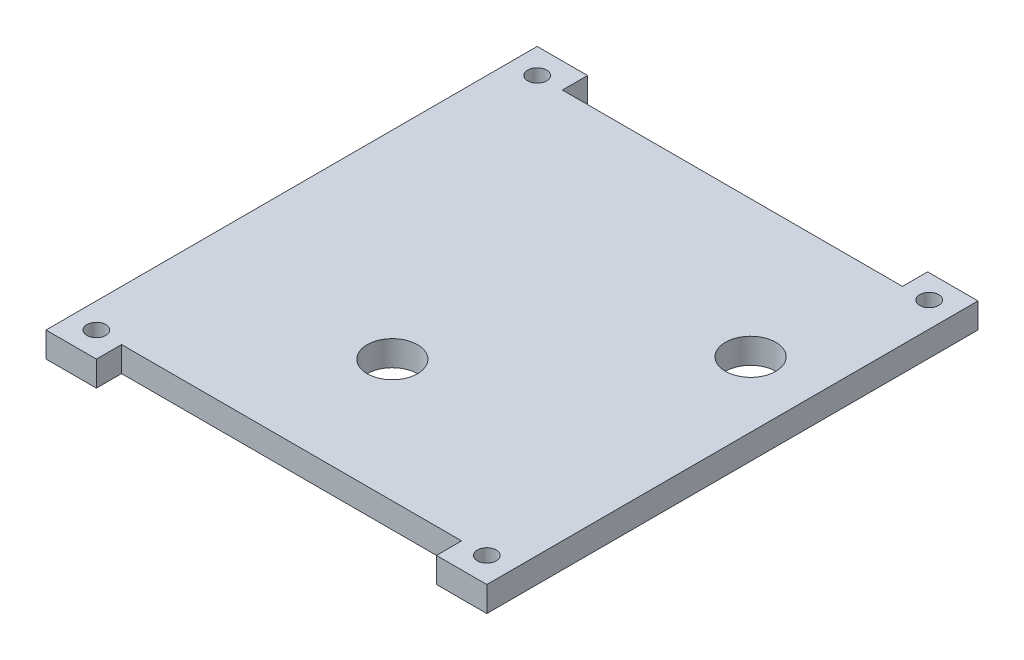
ISO-10303-21;
HEADER;
FILE_DESCRIPTION(('STEP AP214'),'2;1');
FILE_NAME('part.step','',(''),(''),'','','');
FILE_SCHEMA(('AUTOMOTIVE_DESIGN { 1 0 10303 214 1 1 1 1 }'));
ENDSEC;
DATA;
#1=APPLICATION_CONTEXT('core data for automotive mechanical design processes');
#2=APPLICATION_PROTOCOL_DEFINITION('international standard','automotive_design',2000,#1);
#3=PRODUCT_CONTEXT('',#1,'mechanical');
#4=PRODUCT('Part','Part','',(#3));
#5=PRODUCT_RELATED_PRODUCT_CATEGORY('part','',(#4));
#6=PRODUCT_DEFINITION_FORMATION('','',#4);
#7=PRODUCT_DEFINITION_CONTEXT('part definition',#1,'design');
#8=PRODUCT_DEFINITION('design','',#6,#7);
#9=PRODUCT_DEFINITION_SHAPE('','',#8);
#10=(LENGTH_UNIT() NAMED_UNIT(*) SI_UNIT(.MILLI.,.METRE.));
#11=(NAMED_UNIT(*) PLANE_ANGLE_UNIT() SI_UNIT($,.RADIAN.));
#12=(NAMED_UNIT(*) SI_UNIT($,.STERADIAN.) SOLID_ANGLE_UNIT());
#13=UNCERTAINTY_MEASURE_WITH_UNIT(LENGTH_MEASURE(1.E-05),#10,'distance_accuracy_value','');
#14=(GEOMETRIC_REPRESENTATION_CONTEXT(3) GLOBAL_UNCERTAINTY_ASSIGNED_CONTEXT((#13)) GLOBAL_UNIT_ASSIGNED_CONTEXT((#10,
#11,#12)) REPRESENTATION_CONTEXT('',''));
#15=CARTESIAN_POINT('',(0.,0.,0.));
#16=DIRECTION('',(0.,0.,1.));
#17=DIRECTION('',(1.,0.,0.));
#18=AXIS2_PLACEMENT_3D('',#15,#16,#17);
#19=CARTESIAN_POINT('',(0.,6.39061057793059,0.));
#20=DIRECTION('',(0.,1.,0.));
#21=DIRECTION('',(0.,0.,1.));
#22=AXIS2_PLACEMENT_3D('',#19,#20,#21);
#23=PLANE('',#22);
#24=CARTESIAN_POINT('',(26.7181703140351,6.39061057793059,-4.46803612108167));
#25=DIRECTION('',(0.,1.,0.));
#26=DIRECTION('',(0.,0.,1.));
#27=AXIS2_PLACEMENT_3D('',#24,#25,#26);
#28=CIRCLE('',#27,2.);
#29=CARTESIAN_POINT('',(26.7181703140351,6.39061057793059,-2.46803612108167));
#30=VERTEX_POINT('',#29);
#31=EDGE_CURVE('E336',#30,#30,#28,.T.);
#32=ORIENTED_EDGE('',*,*,#31,.F.);
#33=EDGE_LOOP('',(#32));
#34=FACE_BOUND('',#33,.T.);
#35=CARTESIAN_POINT('',(40.7765068233158,6.39061057793059,-18.8579371706753));
#36=DIRECTION('',(0.,1.,0.));
#37=DIRECTION('',(0.,0.,1.));
#38=AXIS2_PLACEMENT_3D('',#35,#36,#37);
#39=CIRCLE('',#38,2.);
#40=CARTESIAN_POINT('',(40.7765068233158,6.39061057793059,-16.8579371706753));
#41=VERTEX_POINT('',#40);
#42=EDGE_CURVE('E338',#41,#41,#39,.T.);
#43=ORIENTED_EDGE('',*,*,#42,.F.);
#44=EDGE_LOOP('',(#43));
#45=FACE_BOUND('',#44,.T.);
#46=CARTESIAN_POINT('',(43.9610437537367,6.39061057793059,-29.8491852885399));
#47=DIRECTION('',(0.,1.,0.));
#48=DIRECTION('',(0.,0.,1.));
#49=AXIS2_PLACEMENT_3D('',#46,#47,#48);
#50=CIRCLE('',#49,0.749999999999991);
#51=CARTESIAN_POINT('',(43.9610437537367,6.39061057793059,-29.0991852885399));
#52=VERTEX_POINT('',#51);
#53=EDGE_CURVE('E359',#52,#52,#50,.T.);
#54=ORIENTED_EDGE('',*,*,#53,.F.);
#55=EDGE_LOOP('',(#54));
#56=FACE_BOUND('',#55,.T.);
#57=CARTESIAN_POINT('',(12.9610437537367,6.39061057793059,5.27335363558905));
#58=DIRECTION('',(0.,1.,0.));
#59=DIRECTION('',(0.,0.,1.));
#60=AXIS2_PLACEMENT_3D('',#57,#58,#59);
#61=CIRCLE('',#60,0.75);
#62=CARTESIAN_POINT('',(12.9610437537367,6.39061057793059,6.02335363558905));
#63=VERTEX_POINT('',#62);
#64=EDGE_CURVE('E174',#63,#63,#61,.T.);
#65=ORIENTED_EDGE('',*,*,#64,.F.);
#66=EDGE_LOOP('',(#65));
#67=FACE_BOUND('',#66,.T.);
#68=DIRECTION('',(-1.,0.,0.));
#69=VECTOR('',#68,1.);
#70=CARTESIAN_POINT('',(14.9610437537367,6.39061057793059,-31.726646364411));
#71=LINE('',#70,#69);
#72=CARTESIAN_POINT('',(14.9610437537367,6.39061057793059,-31.726646364411));
#73=VERTEX_POINT('',#72);
#74=CARTESIAN_POINT('',(10.9610437537367,6.39061057793059,-31.726646364411));
#75=VERTEX_POINT('',#74);
#76=EDGE_CURVE('E204',#73,#75,#71,.T.);
#77=ORIENTED_EDGE('',*,*,#76,.T.);
#78=DIRECTION('',(0.,0.,1.));
#79=VECTOR('',#78,1.);
#80=CARTESIAN_POINT('',(10.9610437537367,6.39061057793059,-31.726646364411));
#81=LINE('',#80,#79);
#82=CARTESIAN_POINT('',(10.9610437537367,6.39061057793059,7.27335363558905));
#83=VERTEX_POINT('',#82);
#84=EDGE_CURVE('E116',#75,#83,#81,.T.);
#85=ORIENTED_EDGE('',*,*,#84,.T.);
#86=DIRECTION('',(1.,0.,0.));
#87=VECTOR('',#86,1.);
#88=CARTESIAN_POINT('',(10.9610437537367,6.39061057793059,7.27335363558905));
#89=LINE('',#88,#87);
#90=CARTESIAN_POINT('',(14.9610437537367,6.39061057793059,7.27335363558905));
#91=VERTEX_POINT('',#90);
#92=EDGE_CURVE('E241',#83,#91,#89,.T.);
#93=ORIENTED_EDGE('',*,*,#92,.T.);
#94=DIRECTION('',(0.,0.,-1.));
#95=VECTOR('',#94,1.);
#96=CARTESIAN_POINT('',(14.9610437537367,6.39061057793059,7.27335363558905));
#97=LINE('',#96,#95);
#98=CARTESIAN_POINT('',(14.9610437537367,6.39061057793059,5.27335363558905));
#99=VERTEX_POINT('',#98);
#100=EDGE_CURVE('E261',#91,#99,#97,.T.);
#101=ORIENTED_EDGE('',*,*,#100,.T.);
#102=DIRECTION('',(1.,0.,0.));
#103=VECTOR('',#102,1.);
#104=CARTESIAN_POINT('',(14.9610437537367,6.39061057793059,5.27335363558905));
#105=LINE('',#104,#103);
#106=CARTESIAN_POINT('',(41.9610437537367,6.39061057793059,5.27335363558905));
#107=VERTEX_POINT('',#106);
#108=EDGE_CURVE('E257',#99,#107,#105,.T.);
#109=ORIENTED_EDGE('',*,*,#108,.T.);
#110=DIRECTION('',(0.,0.,1.));
#111=VECTOR('',#110,1.);
#112=CARTESIAN_POINT('',(41.9610437537367,6.39061057793059,5.27335363558905));
#113=LINE('',#112,#111);
#114=CARTESIAN_POINT('',(41.9610437537367,6.39061057793059,7.27335363558905));
#115=VERTEX_POINT('',#114);
#116=EDGE_CURVE('E260',#107,#115,#113,.T.);
#117=ORIENTED_EDGE('',*,*,#116,.T.);
#118=DIRECTION('',(1.,0.,0.));
#119=VECTOR('',#118,1.);
#120=CARTESIAN_POINT('',(41.9610437537367,6.39061057793059,7.27335363558905));
#121=LINE('',#120,#119);
#122=CARTESIAN_POINT('',(45.9610437537367,6.39061057793059,7.27335363558905));
#123=VERTEX_POINT('',#122);
#124=EDGE_CURVE('E265',#115,#123,#121,.T.);
#125=ORIENTED_EDGE('',*,*,#124,.T.);
#126=DIRECTION('',(0.,0.,-1.));
#127=VECTOR('',#126,1.);
#128=CARTESIAN_POINT('',(45.9610437537367,6.39061057793059,7.27335363558905));
#129=LINE('',#128,#127);
#130=CARTESIAN_POINT('',(45.9610437537367,6.39061057793059,-31.726646364411));
#131=VERTEX_POINT('',#130);
#132=EDGE_CURVE('E272',#123,#131,#129,.T.);
#133=ORIENTED_EDGE('',*,*,#132,.T.);
#134=DIRECTION('',(-1.,0.,0.));
#135=VECTOR('',#134,1.);
#136=CARTESIAN_POINT('',(45.9610437537367,6.39061057793059,-31.726646364411));
#137=LINE('',#136,#135);
#138=CARTESIAN_POINT('',(41.9610437537367,6.39061057793059,-31.726646364411));
#139=VERTEX_POINT('',#138);
#140=EDGE_CURVE('E147',#131,#139,#137,.T.);
#141=ORIENTED_EDGE('',*,*,#140,.T.);
#142=DIRECTION('',(0.,0.,1.));
#143=VECTOR('',#142,1.);
#144=CARTESIAN_POINT('',(41.9610437537367,6.39061057793059,-31.726646364411));
#145=LINE('',#144,#143);
#146=CARTESIAN_POINT('',(41.9610437537367,6.39061057793059,-29.726646364411));
#147=VERTEX_POINT('',#146);
#148=EDGE_CURVE('E141',#139,#147,#145,.T.);
#149=ORIENTED_EDGE('',*,*,#148,.T.);
#150=DIRECTION('',(-1.,0.,0.));
#151=VECTOR('',#150,1.);
#152=CARTESIAN_POINT('',(41.9610437537367,6.39061057793059,-29.726646364411));
#153=LINE('',#152,#151);
#154=CARTESIAN_POINT('',(14.9610437537367,6.39061057793059,-29.726646364411));
#155=VERTEX_POINT('',#154);
#156=EDGE_CURVE('E145',#147,#155,#153,.T.);
#157=ORIENTED_EDGE('',*,*,#156,.T.);
#158=DIRECTION('',(0.,0.,-1.));
#159=VECTOR('',#158,1.);
#160=CARTESIAN_POINT('',(14.9610437537367,6.39061057793059,-29.726646364411));
#161=LINE('',#160,#159);
#162=EDGE_CURVE('E61',#155,#73,#161,.T.);
#163=ORIENTED_EDGE('',*,*,#162,.T.);
#164=EDGE_LOOP('',(#77,#85,#93,#101,#109,#117,#125,#133,#141,#149,#157,#163));
#165=FACE_BOUND('',#164,.T.);
#166=CARTESIAN_POINT('',(43.9610437537367,6.39061057793059,5.27335363558905));
#167=DIRECTION('',(0.,1.,0.));
#168=DIRECTION('',(0.,0.,1.));
#169=AXIS2_PLACEMENT_3D('',#166,#167,#168);
#170=CIRCLE('',#169,0.749999999999998);
#171=CARTESIAN_POINT('',(43.9610437537367,6.39061057793059,6.02335363558905));
#172=VERTEX_POINT('',#171);
#173=EDGE_CURVE('E367',#172,#172,#170,.T.);
#174=ORIENTED_EDGE('',*,*,#173,.F.);
#175=EDGE_LOOP('',(#174));
#176=FACE_BOUND('',#175,.T.);
#177=CARTESIAN_POINT('',(12.9610437537367,6.39061057793059,-29.726646364411));
#178=DIRECTION('',(0.,1.,0.));
#179=DIRECTION('',(0.,0.,1.));
#180=AXIS2_PLACEMENT_3D('',#177,#178,#179);
#181=CIRCLE('',#180,0.75);
#182=CARTESIAN_POINT('',(12.9610437537367,6.39061057793059,-28.976646364411));
#183=VERTEX_POINT('',#182);
#184=EDGE_CURVE('E351',#183,#183,#181,.T.);
#185=ORIENTED_EDGE('',*,*,#184,.F.);
#186=EDGE_LOOP('',(#185));
#187=FACE_BOUND('',#186,.T.);
#188=ADVANCED_FACE('F43',(#34,#45,#56,#67,#165,#176,#187),#23,.T.);
#189=CARTESIAN_POINT('',(0.,4.39061057793059,0.));
#190=DIRECTION('',(0.,1.,0.));
#191=DIRECTION('',(0.,0.,1.));
#192=AXIS2_PLACEMENT_3D('',#189,#190,#191);
#193=PLANE('',#192);
#194=CARTESIAN_POINT('',(26.7181703140351,4.39061057793059,-4.46803612108167));
#195=DIRECTION('',(0.,1.,0.));
#196=DIRECTION('',(0.,0.,1.));
#197=AXIS2_PLACEMENT_3D('',#194,#195,#196);
#198=CIRCLE('',#197,2.);
#199=CARTESIAN_POINT('',(26.7181703140351,4.39061057793059,-2.46803612108167));
#200=VERTEX_POINT('',#199);
#201=EDGE_CURVE('E334',#200,#200,#198,.T.);
#202=ORIENTED_EDGE('',*,*,#201,.T.);
#203=EDGE_LOOP('',(#202));
#204=FACE_BOUND('',#203,.T.);
#205=CARTESIAN_POINT('',(40.7765068233158,4.39061057793059,-18.8579371706753));
#206=DIRECTION('',(0.,1.,0.));
#207=DIRECTION('',(0.,0.,1.));
#208=AXIS2_PLACEMENT_3D('',#205,#206,#207);
#209=CIRCLE('',#208,2.);
#210=CARTESIAN_POINT('',(40.7765068233158,4.39061057793059,-16.8579371706753));
#211=VERTEX_POINT('',#210);
#212=EDGE_CURVE('E345',#211,#211,#209,.T.);
#213=ORIENTED_EDGE('',*,*,#212,.T.);
#214=EDGE_LOOP('',(#213));
#215=FACE_BOUND('',#214,.T.);
#216=DIRECTION('',(-1.,0.,0.));
#217=VECTOR('',#216,1.);
#218=CARTESIAN_POINT('',(14.9610437537367,4.39061057793059,-31.726646364411));
#219=LINE('',#218,#217);
#220=CARTESIAN_POINT('',(14.9610437537367,4.39061057793059,-31.726646364411));
#221=VERTEX_POINT('',#220);
#222=CARTESIAN_POINT('',(10.9610437537367,4.39061057793059,-31.726646364411));
#223=VERTEX_POINT('',#222);
#224=EDGE_CURVE('E169',#221,#223,#219,.T.);
#225=ORIENTED_EDGE('',*,*,#224,.F.);
#226=DIRECTION('',(0.,0.,-1.));
#227=VECTOR('',#226,1.);
#228=CARTESIAN_POINT('',(14.9610437537367,4.39061057793059,-29.726646364411));
#229=LINE('',#228,#227);
#230=CARTESIAN_POINT('',(14.9610437537367,4.39061057793059,-29.726646364411));
#231=VERTEX_POINT('',#230);
#232=EDGE_CURVE('E108',#231,#221,#229,.T.);
#233=ORIENTED_EDGE('',*,*,#232,.F.);
#234=DIRECTION('',(-1.,0.,0.));
#235=VECTOR('',#234,1.);
#236=CARTESIAN_POINT('',(41.9610437537367,4.39061057793059,-29.726646364411));
#237=LINE('',#236,#235);
#238=CARTESIAN_POINT('',(41.9610437537367,4.39061057793059,-29.726646364411));
#239=VERTEX_POINT('',#238);
#240=EDGE_CURVE('E102',#239,#231,#237,.T.);
#241=ORIENTED_EDGE('',*,*,#240,.F.);
#242=DIRECTION('',(0.,0.,1.));
#243=VECTOR('',#242,1.);
#244=CARTESIAN_POINT('',(41.9610437537367,4.39061057793059,-31.726646364411));
#245=LINE('',#244,#243);
#246=CARTESIAN_POINT('',(41.9610437537367,4.39061057793059,-31.726646364411));
#247=VERTEX_POINT('',#246);
#248=EDGE_CURVE('E156',#247,#239,#245,.T.);
#249=ORIENTED_EDGE('',*,*,#248,.F.);
#250=DIRECTION('',(-1.,0.,0.));
#251=VECTOR('',#250,1.);
#252=CARTESIAN_POINT('',(45.9610437537367,4.39061057793059,-31.726646364411));
#253=LINE('',#252,#251);
#254=CARTESIAN_POINT('',(45.9610437537367,4.39061057793059,-31.726646364411));
#255=VERTEX_POINT('',#254);
#256=EDGE_CURVE('E195',#255,#247,#253,.T.);
#257=ORIENTED_EDGE('',*,*,#256,.F.);
#258=DIRECTION('',(0.,0.,-1.));
#259=VECTOR('',#258,1.);
#260=CARTESIAN_POINT('',(45.9610437537367,4.39061057793059,7.27335363558905));
#261=LINE('',#260,#259);
#262=CARTESIAN_POINT('',(45.9610437537367,4.39061057793059,7.27335363558905));
#263=VERTEX_POINT('',#262);
#264=EDGE_CURVE('E192',#263,#255,#261,.T.);
#265=ORIENTED_EDGE('',*,*,#264,.F.);
#266=DIRECTION('',(1.,0.,0.));
#267=VECTOR('',#266,1.);
#268=CARTESIAN_POINT('',(41.9610437537367,4.39061057793059,7.27335363558905));
#269=LINE('',#268,#267);
#270=CARTESIAN_POINT('',(41.9610437537367,4.39061057793059,7.27335363558905));
#271=VERTEX_POINT('',#270);
#272=EDGE_CURVE('E189',#271,#263,#269,.T.);
#273=ORIENTED_EDGE('',*,*,#272,.F.);
#274=DIRECTION('',(0.,0.,1.));
#275=VECTOR('',#274,1.);
#276=CARTESIAN_POINT('',(41.9610437537367,4.39061057793059,5.27335363558905));
#277=LINE('',#276,#275);
#278=CARTESIAN_POINT('',(41.9610437537367,4.39061057793059,5.27335363558905));
#279=VERTEX_POINT('',#278);
#280=EDGE_CURVE('E186',#279,#271,#277,.T.);
#281=ORIENTED_EDGE('',*,*,#280,.F.);
#282=DIRECTION('',(1.,0.,0.));
#283=VECTOR('',#282,1.);
#284=CARTESIAN_POINT('',(14.9610437537367,4.39061057793059,5.27335363558905));
#285=LINE('',#284,#283);
#286=CARTESIAN_POINT('',(14.9610437537367,4.39061057793059,5.27335363558905));
#287=VERTEX_POINT('',#286);
#288=EDGE_CURVE('E183',#287,#279,#285,.T.);
#289=ORIENTED_EDGE('',*,*,#288,.F.);
#290=DIRECTION('',(0.,0.,-1.));
#291=VECTOR('',#290,1.);
#292=CARTESIAN_POINT('',(14.9610437537367,4.39061057793059,7.27335363558905));
#293=LINE('',#292,#291);
#294=CARTESIAN_POINT('',(14.9610437537367,4.39061057793059,7.27335363558905));
#295=VERTEX_POINT('',#294);
#296=EDGE_CURVE('E180',#295,#287,#293,.T.);
#297=ORIENTED_EDGE('',*,*,#296,.F.);
#298=DIRECTION('',(1.,0.,0.));
#299=VECTOR('',#298,1.);
#300=CARTESIAN_POINT('',(10.9610437537367,4.39061057793059,7.27335363558905));
#301=LINE('',#300,#299);
#302=CARTESIAN_POINT('',(10.9610437537367,4.39061057793059,7.27335363558905));
#303=VERTEX_POINT('',#302);
#304=EDGE_CURVE('E177',#303,#295,#301,.T.);
#305=ORIENTED_EDGE('',*,*,#304,.F.);
#306=DIRECTION('',(0.,0.,1.));
#307=VECTOR('',#306,1.);
#308=CARTESIAN_POINT('',(10.9610437537367,4.39061057793059,-31.726646364411));
#309=LINE('',#308,#307);
#310=EDGE_CURVE('E173',#223,#303,#309,.T.);
#311=ORIENTED_EDGE('',*,*,#310,.F.);
#312=EDGE_LOOP('',(#225,#233,#241,#249,#257,#265,#273,#281,#289,#297,#305,#311));
#313=FACE_BOUND('',#312,.T.);
#314=CARTESIAN_POINT('',(12.9610437537367,4.39061057793059,5.27335363558905));
#315=DIRECTION('',(0.,1.,0.));
#316=DIRECTION('',(0.,0.,1.));
#317=AXIS2_PLACEMENT_3D('',#314,#315,#316);
#318=CIRCLE('',#317,0.75);
#319=CARTESIAN_POINT('',(12.9610437537367,4.39061057793059,6.02335363558905));
#320=VERTEX_POINT('',#319);
#321=EDGE_CURVE('E371',#320,#320,#318,.T.);
#322=ORIENTED_EDGE('',*,*,#321,.T.);
#323=EDGE_LOOP('',(#322));
#324=FACE_BOUND('',#323,.T.);
#325=CARTESIAN_POINT('',(43.9610437537367,4.39061057793059,5.27335363558905));
#326=DIRECTION('',(0.,1.,0.));
#327=DIRECTION('',(0.,0.,1.));
#328=AXIS2_PLACEMENT_3D('',#325,#326,#327);
#329=CIRCLE('',#328,0.749999999999998);
#330=CARTESIAN_POINT('',(43.9610437537367,4.39061057793059,6.02335363558905));
#331=VERTEX_POINT('',#330);
#332=EDGE_CURVE('E363',#331,#331,#329,.T.);
#333=ORIENTED_EDGE('',*,*,#332,.T.);
#334=EDGE_LOOP('',(#333));
#335=FACE_BOUND('',#334,.T.);
#336=CARTESIAN_POINT('',(43.9610437537367,4.39061057793059,-29.8491852885399));
#337=DIRECTION('',(0.,1.,0.));
#338=DIRECTION('',(0.,0.,1.));
#339=AXIS2_PLACEMENT_3D('',#336,#337,#338);
#340=CIRCLE('',#339,0.749999999999991);
#341=CARTESIAN_POINT('',(43.9610437537367,4.39061057793059,-29.0991852885399));
#342=VERTEX_POINT('',#341);
#343=EDGE_CURVE('E355',#342,#342,#340,.T.);
#344=ORIENTED_EDGE('',*,*,#343,.T.);
#345=EDGE_LOOP('',(#344));
#346=FACE_BOUND('',#345,.T.);
#347=CARTESIAN_POINT('',(12.9610437537367,4.39061057793059,-29.726646364411));
#348=DIRECTION('',(0.,1.,0.));
#349=DIRECTION('',(0.,0.,1.));
#350=AXIS2_PLACEMENT_3D('',#347,#348,#349);
#351=CIRCLE('',#350,0.75);
#352=CARTESIAN_POINT('',(12.9610437537367,4.39061057793059,-28.976646364411));
#353=VERTEX_POINT('',#352);
#354=EDGE_CURVE('E342',#353,#353,#351,.T.);
#355=ORIENTED_EDGE('',*,*,#354,.T.);
#356=EDGE_LOOP('',(#355));
#357=FACE_BOUND('',#356,.T.);
#358=ADVANCED_FACE('F245',(#204,#215,#313,#324,#335,#346,#357),#193,.F.);
#359=CARTESIAN_POINT('',(14.9610437537367,6.39061057793059,-31.726646364411));
#360=DIRECTION('',(0.,0.,1.));
#361=DIRECTION('',(1.,0.,0.));
#362=AXIS2_PLACEMENT_3D('',#359,#360,#361);
#363=PLANE('',#362);
#364=ORIENTED_EDGE('',*,*,#224,.T.);
#365=DIRECTION('',(0.,-1.,0.));
#366=VECTOR('',#365,1.);
#367=CARTESIAN_POINT('',(10.9610437537367,6.39061057793059,-31.726646364411));
#368=LINE('',#367,#366);
#369=EDGE_CURVE('E11',#75,#223,#368,.T.);
#370=ORIENTED_EDGE('',*,*,#369,.F.);
#371=ORIENTED_EDGE('',*,*,#76,.F.);
#372=DIRECTION('',(0.,-1.,0.));
#373=VECTOR('',#372,1.);
#374=CARTESIAN_POINT('',(14.9610437537367,6.39061057793059,-31.726646364411));
#375=LINE('',#374,#373);
#376=EDGE_CURVE('E165',#73,#221,#375,.T.);
#377=ORIENTED_EDGE('',*,*,#376,.T.);
#378=EDGE_LOOP('',(#364,#370,#371,#377));
#379=FACE_BOUND('',#378,.T.);
#380=ADVANCED_FACE('F45',(#379),#363,.F.);
#381=CARTESIAN_POINT('',(10.9610437537367,6.39061057793059,-31.726646364411));
#382=DIRECTION('',(1.,0.,0.));
#383=DIRECTION('',(0.,0.,-1.));
#384=AXIS2_PLACEMENT_3D('',#381,#382,#383);
#385=PLANE('',#384);
#386=ORIENTED_EDGE('',*,*,#310,.T.);
#387=DIRECTION('',(0.,-1.,0.));
#388=VECTOR('',#387,1.);
#389=CARTESIAN_POINT('',(10.9610437537367,6.39061057793059,7.27335363558905));
#390=LINE('',#389,#388);
#391=EDGE_CURVE('E53',#83,#303,#390,.T.);
#392=ORIENTED_EDGE('',*,*,#391,.F.);
#393=ORIENTED_EDGE('',*,*,#84,.F.);
#394=ORIENTED_EDGE('',*,*,#369,.T.);
#395=EDGE_LOOP('',(#386,#392,#393,#394));
#396=FACE_BOUND('',#395,.T.);
#397=ADVANCED_FACE('F517',(#396),#385,.F.);
#398=CARTESIAN_POINT('',(10.9610437537367,6.39061057793059,7.27335363558905));
#399=DIRECTION('',(0.,0.,-1.));
#400=DIRECTION('',(-1.,0.,0.));
#401=AXIS2_PLACEMENT_3D('',#398,#399,#400);
#402=PLANE('',#401);
#403=ORIENTED_EDGE('',*,*,#304,.T.);
#404=DIRECTION('',(0.,-1.,0.));
#405=VECTOR('',#404,1.);
#406=CARTESIAN_POINT('',(14.9610437537367,6.39061057793059,7.27335363558905));
#407=LINE('',#406,#405);
#408=EDGE_CURVE('E231',#91,#295,#407,.T.);
#409=ORIENTED_EDGE('',*,*,#408,.F.);
#410=ORIENTED_EDGE('',*,*,#92,.F.);
#411=ORIENTED_EDGE('',*,*,#391,.T.);
#412=EDGE_LOOP('',(#403,#409,#410,#411));
#413=FACE_BOUND('',#412,.T.);
#414=ADVANCED_FACE('F239',(#413),#402,.F.);
#415=CARTESIAN_POINT('',(14.9610437537367,6.39061057793059,7.27335363558905));
#416=DIRECTION('',(-1.,0.,0.));
#417=DIRECTION('',(0.,0.,1.));
#418=AXIS2_PLACEMENT_3D('',#415,#416,#417);
#419=PLANE('',#418);
#420=ORIENTED_EDGE('',*,*,#296,.T.);
#421=DIRECTION('',(0.,-1.,0.));
#422=VECTOR('',#421,1.);
#423=CARTESIAN_POINT('',(14.9610437537367,6.39061057793059,5.27335363558905));
#424=LINE('',#423,#422);
#425=EDGE_CURVE('E227',#99,#287,#424,.T.);
#426=ORIENTED_EDGE('',*,*,#425,.F.);
#427=ORIENTED_EDGE('',*,*,#100,.F.);
#428=ORIENTED_EDGE('',*,*,#408,.T.);
#429=EDGE_LOOP('',(#420,#426,#427,#428));
#430=FACE_BOUND('',#429,.T.);
#431=ADVANCED_FACE('F251',(#430),#419,.F.);
#432=CARTESIAN_POINT('',(14.9610437537367,6.39061057793059,5.27335363558905));
#433=DIRECTION('',(0.,0.,-1.));
#434=DIRECTION('',(-1.,0.,0.));
#435=AXIS2_PLACEMENT_3D('',#432,#433,#434);
#436=PLANE('',#435);
#437=ORIENTED_EDGE('',*,*,#288,.T.);
#438=DIRECTION('',(0.,-1.,0.));
#439=VECTOR('',#438,1.);
#440=CARTESIAN_POINT('',(41.9610437537367,6.39061057793059,5.27335363558905));
#441=LINE('',#440,#439);
#442=EDGE_CURVE('E223',#107,#279,#441,.T.);
#443=ORIENTED_EDGE('',*,*,#442,.F.);
#444=ORIENTED_EDGE('',*,*,#108,.F.);
#445=ORIENTED_EDGE('',*,*,#425,.T.);
#446=EDGE_LOOP('',(#437,#443,#444,#445));
#447=FACE_BOUND('',#446,.T.);
#448=ADVANCED_FACE('F255',(#447),#436,.F.);
#449=CARTESIAN_POINT('',(41.9610437537367,6.39061057793059,5.27335363558905));
#450=DIRECTION('',(1.,0.,0.));
#451=DIRECTION('',(0.,0.,-1.));
#452=AXIS2_PLACEMENT_3D('',#449,#450,#451);
#453=PLANE('',#452);
#454=ORIENTED_EDGE('',*,*,#280,.T.);
#455=DIRECTION('',(0.,-1.,0.));
#456=VECTOR('',#455,1.);
#457=CARTESIAN_POINT('',(41.9610437537367,6.39061057793059,7.27335363558905));
#458=LINE('',#457,#456);
#459=EDGE_CURVE('E219',#115,#271,#458,.T.);
#460=ORIENTED_EDGE('',*,*,#459,.F.);
#461=ORIENTED_EDGE('',*,*,#116,.F.);
#462=ORIENTED_EDGE('',*,*,#442,.T.);
#463=EDGE_LOOP('',(#454,#460,#461,#462));
#464=FACE_BOUND('',#463,.T.);
#465=ADVANCED_FACE('F478',(#464),#453,.F.);
#466=CARTESIAN_POINT('',(41.9610437537367,6.39061057793059,7.27335363558905));
#467=DIRECTION('',(0.,0.,-1.));
#468=DIRECTION('',(-1.,0.,0.));
#469=AXIS2_PLACEMENT_3D('',#466,#467,#468);
#470=PLANE('',#469);
#471=ORIENTED_EDGE('',*,*,#272,.T.);
#472=DIRECTION('',(0.,-1.,0.));
#473=VECTOR('',#472,1.);
#474=CARTESIAN_POINT('',(45.9610437537367,6.39061057793059,7.27335363558905));
#475=LINE('',#474,#473);
#476=EDGE_CURVE('E215',#123,#263,#475,.T.);
#477=ORIENTED_EDGE('',*,*,#476,.F.);
#478=ORIENTED_EDGE('',*,*,#124,.F.);
#479=ORIENTED_EDGE('',*,*,#459,.T.);
#480=EDGE_LOOP('',(#471,#477,#478,#479));
#481=FACE_BOUND('',#480,.T.);
#482=ADVANCED_FACE('F468',(#481),#470,.F.);
#483=CARTESIAN_POINT('',(45.9610437537367,6.39061057793059,7.27335363558905));
#484=DIRECTION('',(-1.,0.,0.));
#485=DIRECTION('',(0.,0.,1.));
#486=AXIS2_PLACEMENT_3D('',#483,#484,#485);
#487=PLANE('',#486);
#488=ORIENTED_EDGE('',*,*,#264,.T.);
#489=DIRECTION('',(0.,-1.,0.));
#490=VECTOR('',#489,1.);
#491=CARTESIAN_POINT('',(45.9610437537367,6.39061057793059,-31.726646364411));
#492=LINE('',#491,#490);
#493=EDGE_CURVE('E211',#131,#255,#492,.T.);
#494=ORIENTED_EDGE('',*,*,#493,.F.);
#495=ORIENTED_EDGE('',*,*,#132,.F.);
#496=ORIENTED_EDGE('',*,*,#476,.T.);
#497=EDGE_LOOP('',(#488,#494,#495,#496));
#498=FACE_BOUND('',#497,.T.);
#499=ADVANCED_FACE('F280',(#498),#487,.F.);
#500=CARTESIAN_POINT('',(45.9610437537367,6.39061057793059,-31.726646364411));
#501=DIRECTION('',(0.,0.,1.));
#502=DIRECTION('',(1.,0.,0.));
#503=AXIS2_PLACEMENT_3D('',#500,#501,#502);
#504=PLANE('',#503);
#505=ORIENTED_EDGE('',*,*,#256,.T.);
#506=DIRECTION('',(0.,-1.,0.));
#507=VECTOR('',#506,1.);
#508=CARTESIAN_POINT('',(41.9610437537367,6.39061057793059,-31.726646364411));
#509=LINE('',#508,#507);
#510=EDGE_CURVE('E158',#139,#247,#509,.T.);
#511=ORIENTED_EDGE('',*,*,#510,.F.);
#512=ORIENTED_EDGE('',*,*,#140,.F.);
#513=ORIENTED_EDGE('',*,*,#493,.T.);
#514=EDGE_LOOP('',(#505,#511,#512,#513));
#515=FACE_BOUND('',#514,.T.);
#516=ADVANCED_FACE('F284',(#515),#504,.F.);
#517=CARTESIAN_POINT('',(41.9610437537367,6.39061057793059,-31.726646364411));
#518=DIRECTION('',(1.,0.,0.));
#519=DIRECTION('',(0.,0.,-1.));
#520=AXIS2_PLACEMENT_3D('',#517,#518,#519);
#521=PLANE('',#520);
#522=ORIENTED_EDGE('',*,*,#248,.T.);
#523=DIRECTION('',(0.,-1.,0.));
#524=VECTOR('',#523,1.);
#525=CARTESIAN_POINT('',(41.9610437537367,6.39061057793059,-29.726646364411));
#526=LINE('',#525,#524);
#527=EDGE_CURVE('E153',#147,#239,#526,.T.);
#528=ORIENTED_EDGE('',*,*,#527,.F.);
#529=ORIENTED_EDGE('',*,*,#148,.F.);
#530=ORIENTED_EDGE('',*,*,#510,.T.);
#531=EDGE_LOOP('',(#522,#528,#529,#530));
#532=FACE_BOUND('',#531,.T.);
#533=ADVANCED_FACE('F154',(#532),#521,.F.);
#534=CARTESIAN_POINT('',(41.9610437537367,6.39061057793059,-29.726646364411));
#535=DIRECTION('',(0.,0.,1.));
#536=DIRECTION('',(1.,0.,0.));
#537=AXIS2_PLACEMENT_3D('',#534,#535,#536);
#538=PLANE('',#537);
#539=ORIENTED_EDGE('',*,*,#240,.T.);
#540=DIRECTION('',(0.,-1.,0.));
#541=VECTOR('',#540,1.);
#542=CARTESIAN_POINT('',(14.9610437537367,6.39061057793059,-29.726646364411));
#543=LINE('',#542,#541);
#544=EDGE_CURVE('E159',#155,#231,#543,.T.);
#545=ORIENTED_EDGE('',*,*,#544,.F.);
#546=ORIENTED_EDGE('',*,*,#156,.F.);
#547=ORIENTED_EDGE('',*,*,#527,.T.);
#548=EDGE_LOOP('',(#539,#545,#546,#547));
#549=FACE_BOUND('',#548,.T.);
#550=ADVANCED_FACE('F161',(#549),#538,.F.);
#551=CARTESIAN_POINT('',(14.9610437537367,6.39061057793059,-29.726646364411));
#552=DIRECTION('',(-1.,0.,0.));
#553=DIRECTION('',(0.,0.,1.));
#554=AXIS2_PLACEMENT_3D('',#551,#552,#553);
#555=PLANE('',#554);
#556=ORIENTED_EDGE('',*,*,#232,.T.);
#557=ORIENTED_EDGE('',*,*,#376,.F.);
#558=ORIENTED_EDGE('',*,*,#162,.F.);
#559=ORIENTED_EDGE('',*,*,#544,.T.);
#560=EDGE_LOOP('',(#556,#557,#558,#559));
#561=FACE_BOUND('',#560,.T.);
#562=ADVANCED_FACE('F288',(#561),#555,.F.);
#563=CARTESIAN_POINT('',(12.9610437537367,6.39061057793059,5.27335363558905));
#564=DIRECTION('',(0.,-1.,0.));
#565=DIRECTION('',(0.,0.,-1.));
#566=AXIS2_PLACEMENT_3D('',#563,#564,#565);
#567=CYLINDRICAL_SURFACE('',#566,0.75);
#568=ORIENTED_EDGE('',*,*,#64,.T.);
#569=EDGE_LOOP('',(#568));
#570=FACE_BOUND('',#569,.T.);
#571=ORIENTED_EDGE('',*,*,#321,.F.);
#572=EDGE_LOOP('',(#571));
#573=FACE_BOUND('',#572,.T.);
#574=ADVANCED_FACE('F290',(#570,#573),#567,.F.);
#575=CARTESIAN_POINT('',(43.9610437537367,6.39061057793059,5.27335363558905));
#576=DIRECTION('',(0.,-1.,0.));
#577=DIRECTION('',(0.,0.,-1.));
#578=AXIS2_PLACEMENT_3D('',#575,#576,#577);
#579=CYLINDRICAL_SURFACE('',#578,0.749999999999998);
#580=ORIENTED_EDGE('',*,*,#173,.T.);
#581=EDGE_LOOP('',(#580));
#582=FACE_BOUND('',#581,.T.);
#583=ORIENTED_EDGE('',*,*,#332,.F.);
#584=EDGE_LOOP('',(#583));
#585=FACE_BOUND('',#584,.T.);
#586=ADVANCED_FACE('F296',(#582,#585),#579,.F.);
#587=CARTESIAN_POINT('',(43.9610437537367,6.39061057793059,-29.8491852885399));
#588=DIRECTION('',(0.,-1.,0.));
#589=DIRECTION('',(0.,0.,-1.));
#590=AXIS2_PLACEMENT_3D('',#587,#588,#589);
#591=CYLINDRICAL_SURFACE('',#590,0.749999999999991);
#592=ORIENTED_EDGE('',*,*,#53,.T.);
#593=EDGE_LOOP('',(#592));
#594=FACE_BOUND('',#593,.T.);
#595=ORIENTED_EDGE('',*,*,#343,.F.);
#596=EDGE_LOOP('',(#595));
#597=FACE_BOUND('',#596,.T.);
#598=ADVANCED_FACE('F313',(#594,#597),#591,.F.);
#599=CARTESIAN_POINT('',(12.9610437537367,6.39061057793059,-29.726646364411));
#600=DIRECTION('',(0.,-1.,0.));
#601=DIRECTION('',(0.,0.,-1.));
#602=AXIS2_PLACEMENT_3D('',#599,#600,#601);
#603=CYLINDRICAL_SURFACE('',#602,0.75);
#604=ORIENTED_EDGE('',*,*,#184,.T.);
#605=EDGE_LOOP('',(#604));
#606=FACE_BOUND('',#605,.T.);
#607=ORIENTED_EDGE('',*,*,#354,.F.);
#608=EDGE_LOOP('',(#607));
#609=FACE_BOUND('',#608,.T.);
#610=ADVANCED_FACE('F317',(#606,#609),#603,.F.);
#611=CARTESIAN_POINT('',(40.7765068233158,4.39061057793059,-18.8579371706753));
#612=DIRECTION('',(0.,1.,0.));
#613=DIRECTION('',(0.,0.,1.));
#614=AXIS2_PLACEMENT_3D('',#611,#612,#613);
#615=CYLINDRICAL_SURFACE('',#614,2.);
#616=ORIENTED_EDGE('',*,*,#212,.F.);
#617=EDGE_LOOP('',(#616));
#618=FACE_BOUND('',#617,.T.);
#619=ORIENTED_EDGE('',*,*,#42,.T.);
#620=EDGE_LOOP('',(#619));
#621=FACE_BOUND('',#620,.T.);
#622=ADVANCED_FACE('F321',(#618,#621),#615,.F.);
#623=CARTESIAN_POINT('',(26.7181703140351,4.39061057793059,-4.46803612108167));
#624=DIRECTION('',(0.,1.,0.));
#625=DIRECTION('',(0.,0.,1.));
#626=AXIS2_PLACEMENT_3D('',#623,#624,#625);
#627=CYLINDRICAL_SURFACE('',#626,2.);
#628=ORIENTED_EDGE('',*,*,#201,.F.);
#629=EDGE_LOOP('',(#628));
#630=FACE_BOUND('',#629,.T.);
#631=ORIENTED_EDGE('',*,*,#31,.T.);
#632=EDGE_LOOP('',(#631));
#633=FACE_BOUND('',#632,.T.);
#634=ADVANCED_FACE('F325',(#630,#633),#627,.F.);
#635=CLOSED_SHELL('',(#188,#358,#380,#397,#414,#431,#448,#465,#482,#499,#516,#533,#550,#562,
#574,#586,#598,#610,#622,#634));
#636=MANIFOLD_SOLID_BREP('B2',#635);
#637=ADVANCED_BREP_SHAPE_REPRESENTATION('',(#18,#636),#14);
#638=SHAPE_DEFINITION_REPRESENTATION(#9,#637);
ENDSEC;
END-ISO-10303-21;
